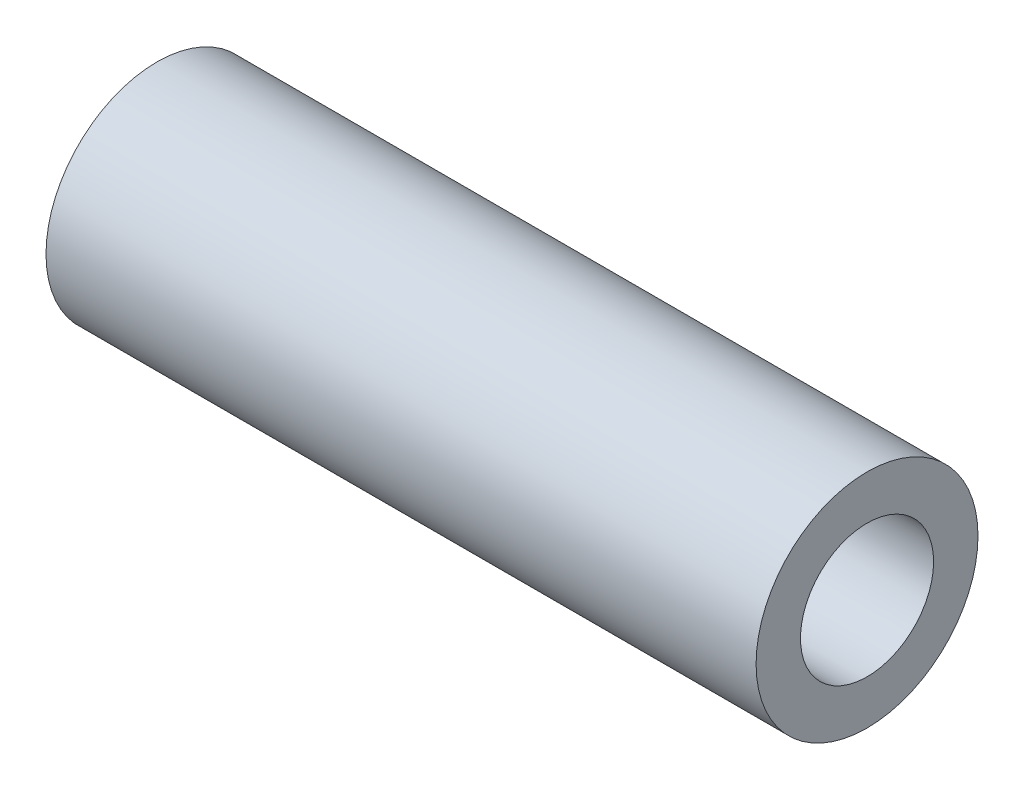
ISO-10303-21;
HEADER;
FILE_DESCRIPTION(('STEP AP214'),'2;1');
FILE_NAME('part.step','',(''),(''),'','','');
FILE_SCHEMA(('AUTOMOTIVE_DESIGN { 1 0 10303 214 1 1 1 1 }'));
ENDSEC;
DATA;
#1=APPLICATION_CONTEXT('core data for automotive mechanical design processes');
#2=APPLICATION_PROTOCOL_DEFINITION('international standard','automotive_design',2000,#1);
#3=PRODUCT_CONTEXT('',#1,'mechanical');
#4=PRODUCT('Part','Part','',(#3));
#5=PRODUCT_RELATED_PRODUCT_CATEGORY('part','',(#4));
#6=PRODUCT_DEFINITION_FORMATION('','',#4);
#7=PRODUCT_DEFINITION_CONTEXT('part definition',#1,'design');
#8=PRODUCT_DEFINITION('design','',#6,#7);
#9=PRODUCT_DEFINITION_SHAPE('','',#8);
#10=(LENGTH_UNIT() NAMED_UNIT(*) SI_UNIT(.MILLI.,.METRE.));
#11=(NAMED_UNIT(*) PLANE_ANGLE_UNIT() SI_UNIT($,.RADIAN.));
#12=(NAMED_UNIT(*) SI_UNIT($,.STERADIAN.) SOLID_ANGLE_UNIT());
#13=UNCERTAINTY_MEASURE_WITH_UNIT(LENGTH_MEASURE(1.E-05),#10,'distance_accuracy_value','');
#14=(GEOMETRIC_REPRESENTATION_CONTEXT(3) GLOBAL_UNCERTAINTY_ASSIGNED_CONTEXT((#13)) GLOBAL_UNIT_ASSIGNED_CONTEXT((#10,
#11,#12)) REPRESENTATION_CONTEXT('',''));
#15=CARTESIAN_POINT('',(0.,0.,0.));
#16=DIRECTION('',(0.,0.,1.));
#17=DIRECTION('',(1.,0.,0.));
#18=AXIS2_PLACEMENT_3D('',#15,#16,#17);
#19=CARTESIAN_POINT('',(25.4,0.,0.));
#20=DIRECTION('',(1.,0.,0.));
#21=DIRECTION('',(0.,0.,-1.));
#22=AXIS2_PLACEMENT_3D('',#19,#20,#21);
#23=PLANE('',#22);
#24=CARTESIAN_POINT('',(25.4,0.,0.));
#25=DIRECTION('',(1.,0.,0.));
#26=DIRECTION('',(0.,0.,-1.));
#27=AXIS2_PLACEMENT_3D('',#24,#25,#26);
#28=CIRCLE('',#27,7.9375);
#29=CARTESIAN_POINT('',(25.4,0.,-7.9375));
#30=VERTEX_POINT('',#29);
#31=EDGE_CURVE('E10',#30,#30,#28,.T.);
#32=ORIENTED_EDGE('',*,*,#31,.T.);
#33=EDGE_LOOP('',(#32));
#34=FACE_BOUND('',#33,.T.);
#35=CARTESIAN_POINT('',(25.4,0.,0.));
#36=DIRECTION('',(1.,0.,0.));
#37=DIRECTION('',(0.,0.,-1.));
#38=AXIS2_PLACEMENT_3D('',#35,#36,#37);
#39=CIRCLE('',#38,4.7625);
#40=CARTESIAN_POINT('',(25.4,0.,-4.7625));
#41=VERTEX_POINT('',#40);
#42=EDGE_CURVE('E42',#41,#41,#39,.T.);
#43=ORIENTED_EDGE('',*,*,#42,.F.);
#44=EDGE_LOOP('',(#43));
#45=FACE_BOUND('',#44,.T.);
#46=ADVANCED_FACE('F31',(#34,#45),#23,.T.);
#47=CARTESIAN_POINT('',(-25.4,0.,0.));
#48=DIRECTION('',(1.,0.,0.));
#49=DIRECTION('',(0.,0.,-1.));
#50=AXIS2_PLACEMENT_3D('',#47,#48,#49);
#51=PLANE('',#50);
#52=CARTESIAN_POINT('',(-25.4,0.,0.));
#53=DIRECTION('',(1.,0.,0.));
#54=DIRECTION('',(0.,0.,-1.));
#55=AXIS2_PLACEMENT_3D('',#52,#53,#54);
#56=CIRCLE('',#55,7.9375);
#57=CARTESIAN_POINT('',(-25.4,0.,-7.9375));
#58=VERTEX_POINT('',#57);
#59=EDGE_CURVE('E35',#58,#58,#56,.T.);
#60=ORIENTED_EDGE('',*,*,#59,.F.);
#61=EDGE_LOOP('',(#60));
#62=FACE_BOUND('',#61,.T.);
#63=CARTESIAN_POINT('',(-25.4,0.,0.));
#64=DIRECTION('',(1.,0.,0.));
#65=DIRECTION('',(0.,0.,-1.));
#66=AXIS2_PLACEMENT_3D('',#63,#64,#65);
#67=CIRCLE('',#66,4.7625);
#68=CARTESIAN_POINT('',(-25.4,0.,-4.7625));
#69=VERTEX_POINT('',#68);
#70=EDGE_CURVE('E44',#69,#69,#67,.T.);
#71=ORIENTED_EDGE('',*,*,#70,.T.);
#72=EDGE_LOOP('',(#71));
#73=FACE_BOUND('',#72,.T.);
#74=ADVANCED_FACE('F54',(#62,#73),#51,.F.);
#75=CARTESIAN_POINT('',(25.4,0.,0.));
#76=DIRECTION('',(-1.,0.,0.));
#77=DIRECTION('',(0.,0.,1.));
#78=AXIS2_PLACEMENT_3D('',#75,#76,#77);
#79=CYLINDRICAL_SURFACE('',#78,7.9375);
#80=ORIENTED_EDGE('',*,*,#31,.F.);
#81=EDGE_LOOP('',(#80));
#82=FACE_BOUND('',#81,.T.);
#83=ORIENTED_EDGE('',*,*,#59,.T.);
#84=EDGE_LOOP('',(#83));
#85=FACE_BOUND('',#84,.T.);
#86=ADVANCED_FACE('F33',(#82,#85),#79,.T.);
#87=CARTESIAN_POINT('',(25.4,0.,0.));
#88=DIRECTION('',(-1.,0.,0.));
#89=DIRECTION('',(0.,0.,1.));
#90=AXIS2_PLACEMENT_3D('',#87,#88,#89);
#91=CYLINDRICAL_SURFACE('',#90,4.7625);
#92=ORIENTED_EDGE('',*,*,#42,.T.);
#93=EDGE_LOOP('',(#92));
#94=FACE_BOUND('',#93,.T.);
#95=ORIENTED_EDGE('',*,*,#70,.F.);
#96=EDGE_LOOP('',(#95));
#97=FACE_BOUND('',#96,.T.);
#98=ADVANCED_FACE('F50',(#94,#97),#91,.F.);
#99=CLOSED_SHELL('',(#46,#74,#86,#98));
#100=MANIFOLD_SOLID_BREP('B2',#99);
#101=ADVANCED_BREP_SHAPE_REPRESENTATION('',(#18,#100),#14);
#102=SHAPE_DEFINITION_REPRESENTATION(#9,#101);
ENDSEC;
END-ISO-10303-21;
